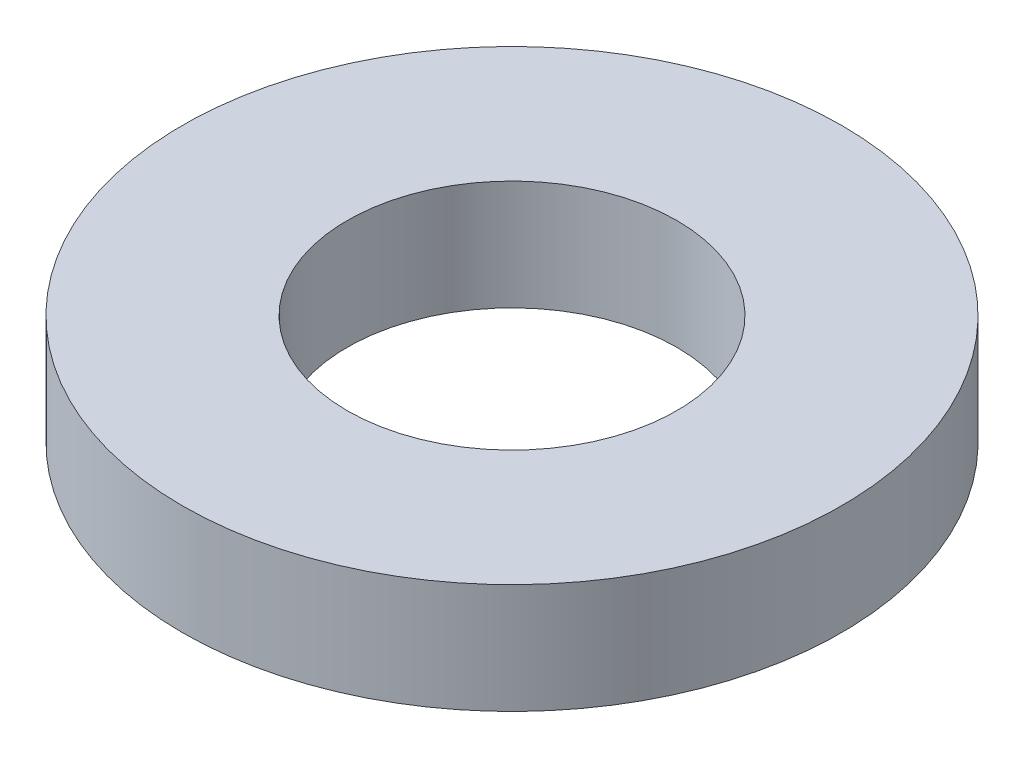
ISO-10303-21;
HEADER;
FILE_DESCRIPTION(('STEP AP214'),'2;1');
FILE_NAME('part.step','',(''),(''),'','','');
FILE_SCHEMA(('AUTOMOTIVE_DESIGN { 1 0 10303 214 1 1 1 1 }'));
ENDSEC;
DATA;
#1=APPLICATION_CONTEXT('core data for automotive mechanical design processes');
#2=APPLICATION_PROTOCOL_DEFINITION('international standard','automotive_design',2000,#1);
#3=PRODUCT_CONTEXT('',#1,'mechanical');
#4=PRODUCT('Part','Part','',(#3));
#5=PRODUCT_RELATED_PRODUCT_CATEGORY('part','',(#4));
#6=PRODUCT_DEFINITION_FORMATION('','',#4);
#7=PRODUCT_DEFINITION_CONTEXT('part definition',#1,'design');
#8=PRODUCT_DEFINITION('design','',#6,#7);
#9=PRODUCT_DEFINITION_SHAPE('','',#8);
#10=(LENGTH_UNIT() NAMED_UNIT(*) SI_UNIT(.MILLI.,.METRE.));
#11=(NAMED_UNIT(*) PLANE_ANGLE_UNIT() SI_UNIT($,.RADIAN.));
#12=(NAMED_UNIT(*) SI_UNIT($,.STERADIAN.) SOLID_ANGLE_UNIT());
#13=UNCERTAINTY_MEASURE_WITH_UNIT(LENGTH_MEASURE(1.E-05),#10,'distance_accuracy_value','');
#14=(GEOMETRIC_REPRESENTATION_CONTEXT(3) GLOBAL_UNCERTAINTY_ASSIGNED_CONTEXT((#13)) GLOBAL_UNIT_ASSIGNED_CONTEXT((#10,
#11,#12)) REPRESENTATION_CONTEXT('',''));
#15=CARTESIAN_POINT('',(0.,0.,0.));
#16=DIRECTION('',(0.,0.,1.));
#17=DIRECTION('',(1.,0.,0.));
#18=AXIS2_PLACEMENT_3D('',#15,#16,#17);
#19=CARTESIAN_POINT('',(0.,10.,0.));
#20=DIRECTION('',(0.,1.,0.));
#21=DIRECTION('',(0.,0.,1.));
#22=AXIS2_PLACEMENT_3D('',#19,#20,#21);
#23=PLANE('',#22);
#24=CARTESIAN_POINT('',(0.,10.,0.));
#25=DIRECTION('',(0.,1.,0.));
#26=DIRECTION('',(0.,0.,1.));
#27=AXIS2_PLACEMENT_3D('',#24,#25,#26);
#28=CIRCLE('',#27,30.);
#29=CARTESIAN_POINT('',(0.,10.,30.));
#30=VERTEX_POINT('',#29);
#31=EDGE_CURVE('E10',#30,#30,#28,.T.);
#32=ORIENTED_EDGE('',*,*,#31,.T.);
#33=EDGE_LOOP('',(#32));
#34=FACE_BOUND('',#33,.T.);
#35=CARTESIAN_POINT('',(0.,10.,0.));
#36=DIRECTION('',(0.,1.,0.));
#37=DIRECTION('',(0.,0.,1.));
#38=AXIS2_PLACEMENT_3D('',#35,#36,#37);
#39=CIRCLE('',#38,15.);
#40=CARTESIAN_POINT('',(0.,10.,15.));
#41=VERTEX_POINT('',#40);
#42=EDGE_CURVE('E50',#41,#41,#39,.T.);
#43=ORIENTED_EDGE('',*,*,#42,.F.);
#44=EDGE_LOOP('',(#43));
#45=FACE_BOUND('',#44,.T.);
#46=ADVANCED_FACE('F37',(#34,#45),#23,.T.);
#47=CARTESIAN_POINT('',(0.,0.,0.));
#48=DIRECTION('',(0.,1.,0.));
#49=DIRECTION('',(0.,0.,1.));
#50=AXIS2_PLACEMENT_3D('',#47,#48,#49);
#51=PLANE('',#50);
#52=CARTESIAN_POINT('',(0.,0.,0.));
#53=DIRECTION('',(0.,1.,0.));
#54=DIRECTION('',(0.,0.,1.));
#55=AXIS2_PLACEMENT_3D('',#52,#53,#54);
#56=CIRCLE('',#55,30.);
#57=CARTESIAN_POINT('',(0.,0.,30.));
#58=VERTEX_POINT('',#57);
#59=EDGE_CURVE('E41',#58,#58,#56,.T.);
#60=ORIENTED_EDGE('',*,*,#59,.F.);
#61=EDGE_LOOP('',(#60));
#62=FACE_BOUND('',#61,.T.);
#63=CARTESIAN_POINT('',(0.,0.,0.));
#64=DIRECTION('',(0.,1.,0.));
#65=DIRECTION('',(0.,0.,1.));
#66=AXIS2_PLACEMENT_3D('',#63,#64,#65);
#67=CIRCLE('',#66,15.);
#68=CARTESIAN_POINT('',(0.,0.,15.));
#69=VERTEX_POINT('',#68);
#70=EDGE_CURVE('E52',#69,#69,#67,.T.);
#71=ORIENTED_EDGE('',*,*,#70,.T.);
#72=EDGE_LOOP('',(#71));
#73=FACE_BOUND('',#72,.T.);
#74=ADVANCED_FACE('F64',(#62,#73),#51,.F.);
#75=CARTESIAN_POINT('',(0.,10.,0.));
#76=DIRECTION('',(0.,-1.,0.));
#77=DIRECTION('',(0.,0.,-1.));
#78=AXIS2_PLACEMENT_3D('',#75,#76,#77);
#79=CYLINDRICAL_SURFACE('',#78,30.);
#80=ORIENTED_EDGE('',*,*,#31,.F.);
#81=EDGE_LOOP('',(#80));
#82=FACE_BOUND('',#81,.T.);
#83=ORIENTED_EDGE('',*,*,#59,.T.);
#84=EDGE_LOOP('',(#83));
#85=FACE_BOUND('',#84,.T.);
#86=ADVANCED_FACE('F39',(#82,#85),#79,.T.);
#87=CARTESIAN_POINT('',(0.,10.,0.));
#88=DIRECTION('',(0.,-1.,0.));
#89=DIRECTION('',(0.,0.,-1.));
#90=AXIS2_PLACEMENT_3D('',#87,#88,#89);
#91=CYLINDRICAL_SURFACE('',#90,15.);
#92=ORIENTED_EDGE('',*,*,#42,.T.);
#93=EDGE_LOOP('',(#92));
#94=FACE_BOUND('',#93,.T.);
#95=ORIENTED_EDGE('',*,*,#70,.F.);
#96=EDGE_LOOP('',(#95));
#97=FACE_BOUND('',#96,.T.);
#98=ADVANCED_FACE('F60',(#94,#97),#91,.F.);
#99=CLOSED_SHELL('',(#46,#74,#86,#98));
#100=MANIFOLD_SOLID_BREP('B2',#99);
#101=ADVANCED_BREP_SHAPE_REPRESENTATION('',(#18,#100),#14);
#102=SHAPE_DEFINITION_REPRESENTATION(#9,#101);
ENDSEC;
END-ISO-10303-21;
